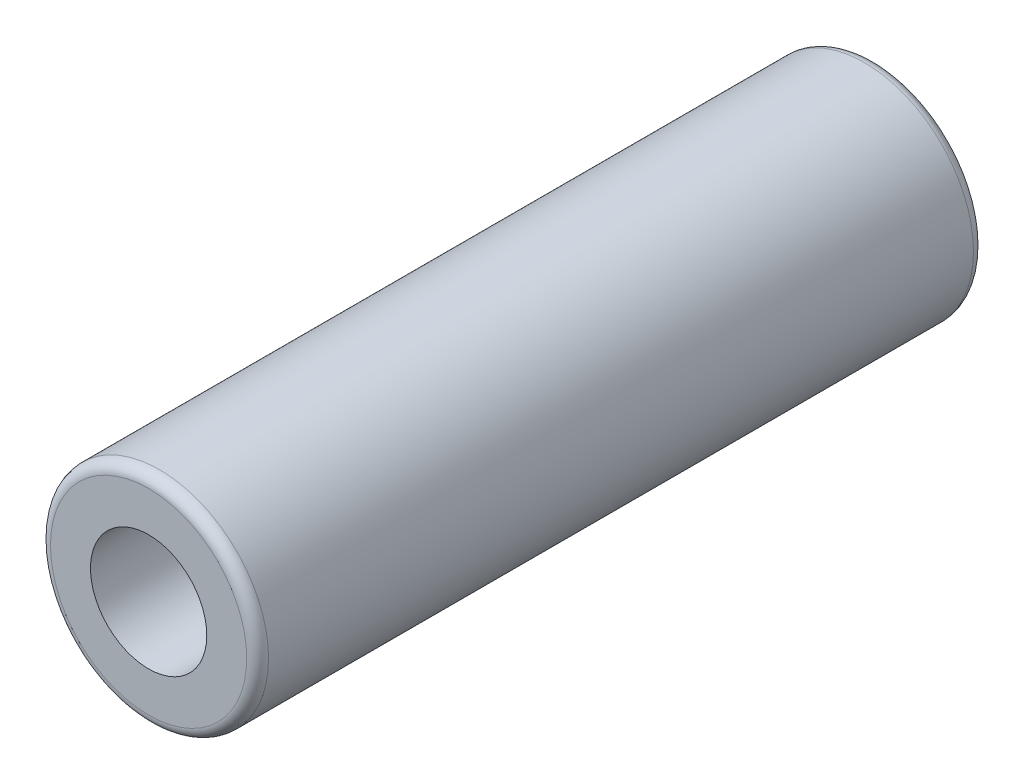
ISO-10303-21;
HEADER;
FILE_DESCRIPTION(('STEP AP214'),'2;1');
FILE_NAME('part.step','',(''),(''),'','','');
FILE_SCHEMA(('AUTOMOTIVE_DESIGN { 1 0 10303 214 1 1 1 1 }'));
ENDSEC;
DATA;
#1=APPLICATION_CONTEXT('core data for automotive mechanical design processes');
#2=APPLICATION_PROTOCOL_DEFINITION('international standard','automotive_design',2000,#1);
#3=PRODUCT_CONTEXT('',#1,'mechanical');
#4=PRODUCT('Part','Part','',(#3));
#5=PRODUCT_RELATED_PRODUCT_CATEGORY('part','',(#4));
#6=PRODUCT_DEFINITION_FORMATION('','',#4);
#7=PRODUCT_DEFINITION_CONTEXT('part definition',#1,'design');
#8=PRODUCT_DEFINITION('design','',#6,#7);
#9=PRODUCT_DEFINITION_SHAPE('','',#8);
#10=(LENGTH_UNIT() NAMED_UNIT(*) SI_UNIT(.MILLI.,.METRE.));
#11=(NAMED_UNIT(*) PLANE_ANGLE_UNIT() SI_UNIT($,.RADIAN.));
#12=(NAMED_UNIT(*) SI_UNIT($,.STERADIAN.) SOLID_ANGLE_UNIT());
#13=UNCERTAINTY_MEASURE_WITH_UNIT(LENGTH_MEASURE(1.E-05),#10,'distance_accuracy_value','');
#14=(GEOMETRIC_REPRESENTATION_CONTEXT(3) GLOBAL_UNCERTAINTY_ASSIGNED_CONTEXT((#13)) GLOBAL_UNIT_ASSIGNED_CONTEXT((#10,
#11,#12)) REPRESENTATION_CONTEXT('',''));
#15=CARTESIAN_POINT('',(0.,0.,0.));
#16=DIRECTION('',(0.,0.,1.));
#17=DIRECTION('',(1.,0.,0.));
#18=AXIS2_PLACEMENT_3D('',#15,#16,#17);
#19=CARTESIAN_POINT('',(0.,0.,20.));
#20=DIRECTION('',(0.,0.,1.));
#21=DIRECTION('',(1.,0.,0.));
#22=AXIS2_PLACEMENT_3D('',#19,#20,#21);
#23=PLANE('',#22);
#24=CARTESIAN_POINT('',(0.,0.,20.));
#25=DIRECTION('',(0.,0.,1.));
#26=DIRECTION('',(1.,0.,0.));
#27=AXIS2_PLACEMENT_3D('',#24,#25,#26);
#28=CIRCLE('',#27,2.7);
#29=CARTESIAN_POINT('',(2.7,0.,20.));
#30=VERTEX_POINT('',#29);
#31=EDGE_CURVE('E10',#30,#30,#28,.T.);
#32=ORIENTED_EDGE('',*,*,#31,.T.);
#33=EDGE_LOOP('',(#32));
#34=FACE_BOUND('',#33,.T.);
#35=CARTESIAN_POINT('',(0.,0.,20.));
#36=DIRECTION('',(0.,0.,1.));
#37=DIRECTION('',(1.,0.,0.));
#38=AXIS2_PLACEMENT_3D('',#35,#36,#37);
#39=CIRCLE('',#38,1.6);
#40=CARTESIAN_POINT('',(1.6,0.,20.));
#41=VERTEX_POINT('',#40);
#42=EDGE_CURVE('E50',#41,#41,#39,.T.);
#43=ORIENTED_EDGE('',*,*,#42,.F.);
#44=EDGE_LOOP('',(#43));
#45=FACE_BOUND('',#44,.T.);
#46=ADVANCED_FACE('F30',(#34,#45),#23,.T.);
#47=CARTESIAN_POINT('',(0.,0.,0.));
#48=DIRECTION('',(0.,0.,1.));
#49=DIRECTION('',(1.,0.,0.));
#50=AXIS2_PLACEMENT_3D('',#47,#48,#49);
#51=PLANE('',#50);
#52=CARTESIAN_POINT('',(0.,0.,0.));
#53=DIRECTION('',(0.,0.,1.));
#54=DIRECTION('',(1.,0.,0.));
#55=AXIS2_PLACEMENT_3D('',#52,#53,#54);
#56=CIRCLE('',#55,2.7);
#57=CARTESIAN_POINT('',(2.7,0.,0.));
#58=VERTEX_POINT('',#57);
#59=EDGE_CURVE('E37',#58,#58,#56,.F.);
#60=ORIENTED_EDGE('',*,*,#59,.T.);
#61=EDGE_LOOP('',(#60));
#62=FACE_BOUND('',#61,.T.);
#63=CARTESIAN_POINT('',(0.,0.,0.));
#64=DIRECTION('',(0.,0.,1.));
#65=DIRECTION('',(1.,0.,0.));
#66=AXIS2_PLACEMENT_3D('',#63,#64,#65);
#67=CIRCLE('',#66,1.6);
#68=CARTESIAN_POINT('',(1.6,0.,0.));
#69=VERTEX_POINT('',#68);
#70=EDGE_CURVE('E51',#69,#69,#67,.T.);
#71=ORIENTED_EDGE('',*,*,#70,.T.);
#72=EDGE_LOOP('',(#71));
#73=FACE_BOUND('',#72,.T.);
#74=ADVANCED_FACE('F61',(#62,#73),#51,.F.);
#75=CARTESIAN_POINT('',(0.,0.,20.));
#76=DIRECTION('',(0.,0.,-1.));
#77=DIRECTION('',(-1.,0.,0.));
#78=AXIS2_PLACEMENT_3D('',#75,#76,#77);
#79=CYLINDRICAL_SURFACE('',#78,3.);
#80=CARTESIAN_POINT('',(0.,0.,0.300000000000002));
#81=DIRECTION('',(0.,0.,1.));
#82=DIRECTION('',(1.,0.,0.));
#83=AXIS2_PLACEMENT_3D('',#80,#81,#82);
#84=CIRCLE('',#83,3.);
#85=CARTESIAN_POINT('',(3.,0.,0.300000000000002));
#86=VERTEX_POINT('',#85);
#87=EDGE_CURVE('E41',#86,#86,#84,.T.);
#88=ORIENTED_EDGE('',*,*,#87,.T.);
#89=EDGE_LOOP('',(#88));
#90=FACE_BOUND('',#89,.T.);
#91=CARTESIAN_POINT('',(0.,0.,19.7));
#92=DIRECTION('',(0.,0.,1.));
#93=DIRECTION('',(1.,0.,0.));
#94=AXIS2_PLACEMENT_3D('',#91,#92,#93);
#95=CIRCLE('',#94,3.);
#96=CARTESIAN_POINT('',(3.,0.,19.7));
#97=VERTEX_POINT('',#96);
#98=EDGE_CURVE('E45',#97,#97,#95,.F.);
#99=ORIENTED_EDGE('',*,*,#98,.T.);
#100=EDGE_LOOP('',(#99));
#101=FACE_BOUND('',#100,.T.);
#102=ADVANCED_FACE('F66',(#90,#101),#79,.T.);
#103=CARTESIAN_POINT('',(0.,0.,20.));
#104=DIRECTION('',(0.,0.,-1.));
#105=DIRECTION('',(-1.,0.,0.));
#106=AXIS2_PLACEMENT_3D('',#103,#104,#105);
#107=CYLINDRICAL_SURFACE('',#106,1.6);
#108=ORIENTED_EDGE('',*,*,#42,.T.);
#109=EDGE_LOOP('',(#108));
#110=FACE_BOUND('',#109,.T.);
#111=ORIENTED_EDGE('',*,*,#70,.F.);
#112=EDGE_LOOP('',(#111));
#113=FACE_BOUND('',#112,.T.);
#114=ADVANCED_FACE('F57',(#110,#113),#107,.F.);
#115=CARTESIAN_POINT('',(0.,0.,0.300000000000002));
#116=DIRECTION('',(0.,0.,1.));
#117=DIRECTION('',(1.,0.,0.));
#118=AXIS2_PLACEMENT_3D('',#115,#116,#117);
#119=TOROIDAL_SURFACE('',#118,2.7,0.3);
#120=ORIENTED_EDGE('',*,*,#59,.F.);
#121=EDGE_LOOP('',(#120));
#122=FACE_BOUND('',#121,.T.);
#123=ORIENTED_EDGE('',*,*,#87,.F.);
#124=EDGE_LOOP('',(#123));
#125=FACE_BOUND('',#124,.T.);
#126=ADVANCED_FACE('F72',(#122,#125),#119,.T.);
#127=CARTESIAN_POINT('',(0.,0.,19.7));
#128=DIRECTION('',(0.,0.,1.));
#129=DIRECTION('',(1.,0.,0.));
#130=AXIS2_PLACEMENT_3D('',#127,#128,#129);
#131=TOROIDAL_SURFACE('',#130,2.7,0.3);
#132=ORIENTED_EDGE('',*,*,#98,.F.);
#133=EDGE_LOOP('',(#132));
#134=FACE_BOUND('',#133,.T.);
#135=ORIENTED_EDGE('',*,*,#31,.F.);
#136=EDGE_LOOP('',(#135));
#137=FACE_BOUND('',#136,.T.);
#138=ADVANCED_FACE('F32',(#134,#137),#131,.T.);
#139=CLOSED_SHELL('',(#46,#74,#102,#114,#126,#138));
#140=MANIFOLD_SOLID_BREP('B2',#139);
#141=ADVANCED_BREP_SHAPE_REPRESENTATION('',(#18,#140),#14);
#142=SHAPE_DEFINITION_REPRESENTATION(#9,#141);
ENDSEC;
END-ISO-10303-21;
